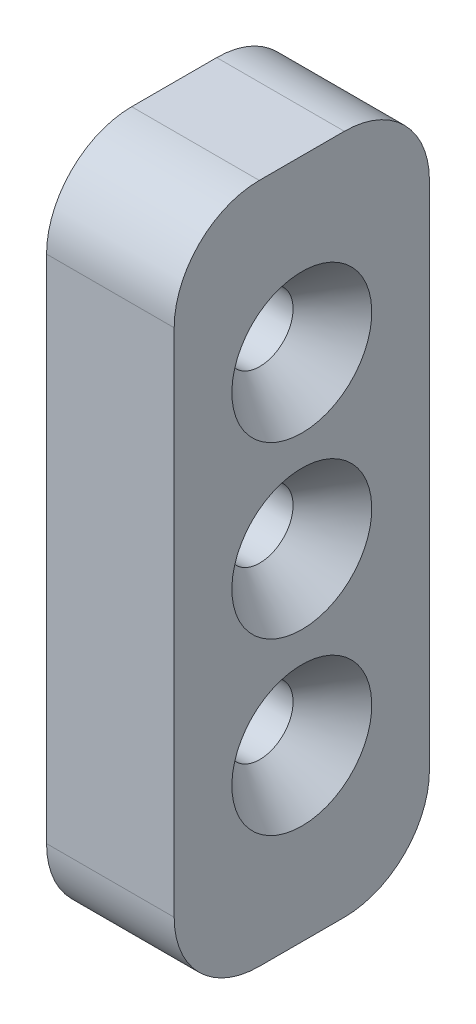
ISO-10303-21;
HEADER;
FILE_DESCRIPTION(('STEP AP214'),'2;1');
FILE_NAME('part.step','',(''),(''),'','','');
FILE_SCHEMA(('AUTOMOTIVE_DESIGN { 1 0 10303 214 1 1 1 1 }'));
ENDSEC;
DATA;
#1=APPLICATION_CONTEXT('core data for automotive mechanical design processes');
#2=APPLICATION_PROTOCOL_DEFINITION('international standard','automotive_design',2000,#1);
#3=PRODUCT_CONTEXT('',#1,'mechanical');
#4=PRODUCT('Part','Part','',(#3));
#5=PRODUCT_RELATED_PRODUCT_CATEGORY('part','',(#4));
#6=PRODUCT_DEFINITION_FORMATION('','',#4);
#7=PRODUCT_DEFINITION_CONTEXT('part definition',#1,'design');
#8=PRODUCT_DEFINITION('design','',#6,#7);
#9=PRODUCT_DEFINITION_SHAPE('','',#8);
#10=(LENGTH_UNIT() NAMED_UNIT(*) SI_UNIT(.MILLI.,.METRE.));
#11=(NAMED_UNIT(*) PLANE_ANGLE_UNIT() SI_UNIT($,.RADIAN.));
#12=(NAMED_UNIT(*) SI_UNIT($,.STERADIAN.) SOLID_ANGLE_UNIT());
#13=UNCERTAINTY_MEASURE_WITH_UNIT(LENGTH_MEASURE(1.E-05),#10,'distance_accuracy_value','');
#14=(GEOMETRIC_REPRESENTATION_CONTEXT(3) GLOBAL_UNCERTAINTY_ASSIGNED_CONTEXT((#13)) GLOBAL_UNIT_ASSIGNED_CONTEXT((#10,
#11,#12)) REPRESENTATION_CONTEXT('',''));
#15=CARTESIAN_POINT('',(0.,0.,0.));
#16=DIRECTION('',(0.,0.,1.));
#17=DIRECTION('',(1.,0.,0.));
#18=AXIS2_PLACEMENT_3D('',#15,#16,#17);
#19=CARTESIAN_POINT('',(333.375,4.03370492239524,361.95));
#20=DIRECTION('',(0.,0.,1.));
#21=DIRECTION('',(1.,0.,0.));
#22=AXIS2_PLACEMENT_3D('',#19,#20,#21);
#23=PLANE('',#22);
#24=DIRECTION('',(0.,1.,0.));
#25=VECTOR('',#24,1.);
#26=CARTESIAN_POINT('',(323.85,4.03370492239524,361.95));
#27=LINE('',#26,#25);
#28=CARTESIAN_POINT('',(323.85,-15.0162950776049,361.95));
#29=VERTEX_POINT('',#28);
#30=CARTESIAN_POINT('',(323.85,23.0837049223954,361.95));
#31=VERTEX_POINT('',#30);
#32=EDGE_CURVE('E93',#29,#31,#27,.T.);
#33=ORIENTED_EDGE('',*,*,#32,.F.);
#34=DIRECTION('',(-1.,0.,0.));
#35=VECTOR('',#34,1.);
#36=CARTESIAN_POINT('',(333.375,-15.0162950776049,361.95));
#37=LINE('',#36,#35);
#38=CARTESIAN_POINT('',(333.375,-15.0162950776049,361.95));
#39=VERTEX_POINT('',#38);
#40=EDGE_CURVE('E26',#29,#39,#37,.F.);
#41=ORIENTED_EDGE('',*,*,#40,.T.);
#42=DIRECTION('',(0.,1.,0.));
#43=VECTOR('',#42,1.);
#44=CARTESIAN_POINT('',(333.375,4.03370492239524,361.95));
#45=LINE('',#44,#43);
#46=CARTESIAN_POINT('',(333.375,23.0837049223954,361.95));
#47=VERTEX_POINT('',#46);
#48=EDGE_CURVE('E193',#39,#47,#45,.T.);
#49=ORIENTED_EDGE('',*,*,#48,.T.);
#50=DIRECTION('',(-1.,0.,0.));
#51=VECTOR('',#50,1.);
#52=CARTESIAN_POINT('',(333.375,23.0837049223954,361.95));
#53=LINE('',#52,#51);
#54=EDGE_CURVE('E139',#47,#31,#53,.T.);
#55=ORIENTED_EDGE('',*,*,#54,.T.);
#56=EDGE_LOOP('',(#33,#41,#49,#55));
#57=FACE_BOUND('',#56,.T.);
#58=ADVANCED_FACE('F17',(#57),#23,.T.);
#59=CARTESIAN_POINT('',(333.375,-21.3662950776048,352.425));
#60=DIRECTION('',(0.,1.,0.));
#61=DIRECTION('',(-1.,0.,0.));
#62=AXIS2_PLACEMENT_3D('',#59,#60,#61);
#63=PLANE('',#62);
#64=DIRECTION('',(0.,0.,-1.));
#65=VECTOR('',#64,1.);
#66=CARTESIAN_POINT('',(333.375,-21.3662950776048,352.425));
#67=LINE('',#66,#65);
#68=CARTESIAN_POINT('',(333.375,-21.3662950776048,355.6));
#69=VERTEX_POINT('',#68);
#70=CARTESIAN_POINT('',(333.375,-21.3662950776048,349.25));
#71=VERTEX_POINT('',#70);
#72=EDGE_CURVE('E109',#69,#71,#67,.T.);
#73=ORIENTED_EDGE('',*,*,#72,.F.);
#74=DIRECTION('',(-1.,0.,0.));
#75=VECTOR('',#74,1.);
#76=CARTESIAN_POINT('',(323.85,-21.3662950776048,355.6));
#77=LINE('',#76,#75);
#78=CARTESIAN_POINT('',(323.85,-21.3662950776048,355.6));
#79=VERTEX_POINT('',#78);
#80=EDGE_CURVE('E152',#69,#79,#77,.T.);
#81=ORIENTED_EDGE('',*,*,#80,.T.);
#82=DIRECTION('',(0.,0.,-1.));
#83=VECTOR('',#82,1.);
#84=CARTESIAN_POINT('',(323.85,-21.3662950776048,352.425));
#85=LINE('',#84,#83);
#86=CARTESIAN_POINT('',(323.85,-21.3662950776048,349.25));
#87=VERTEX_POINT('',#86);
#88=EDGE_CURVE('E162',#79,#87,#85,.T.);
#89=ORIENTED_EDGE('',*,*,#88,.T.);
#90=DIRECTION('',(-1.,0.,0.));
#91=VECTOR('',#90,1.);
#92=CARTESIAN_POINT('',(333.375,-21.3662950776048,349.25));
#93=LINE('',#92,#91);
#94=EDGE_CURVE('E132',#87,#71,#93,.F.);
#95=ORIENTED_EDGE('',*,*,#94,.T.);
#96=EDGE_LOOP('',(#73,#81,#89,#95));
#97=FACE_BOUND('',#96,.T.);
#98=ADVANCED_FACE('F220',(#97),#63,.F.);
#99=CARTESIAN_POINT('',(333.375,4.03370492239524,342.9));
#100=DIRECTION('',(0.,0.,1.));
#101=DIRECTION('',(1.,0.,0.));
#102=AXIS2_PLACEMENT_3D('',#99,#100,#101);
#103=PLANE('',#102);
#104=DIRECTION('',(0.,1.,0.));
#105=VECTOR('',#104,1.);
#106=CARTESIAN_POINT('',(333.375,4.03370492239524,342.9));
#107=LINE('',#106,#105);
#108=CARTESIAN_POINT('',(333.375,-15.0162950776049,342.9));
#109=VERTEX_POINT('',#108);
#110=CARTESIAN_POINT('',(333.375,23.0837049223954,342.9));
#111=VERTEX_POINT('',#110);
#112=EDGE_CURVE('E114',#109,#111,#107,.T.);
#113=ORIENTED_EDGE('',*,*,#112,.F.);
#114=DIRECTION('',(-1.,0.,0.));
#115=VECTOR('',#114,1.);
#116=CARTESIAN_POINT('',(333.375,-15.0162950776049,342.9));
#117=LINE('',#116,#115);
#118=CARTESIAN_POINT('',(323.85,-15.0162950776049,342.9));
#119=VERTEX_POINT('',#118);
#120=EDGE_CURVE('E124',#109,#119,#117,.T.);
#121=ORIENTED_EDGE('',*,*,#120,.T.);
#122=DIRECTION('',(0.,1.,0.));
#123=VECTOR('',#122,1.);
#124=CARTESIAN_POINT('',(323.85,4.03370492239524,342.9));
#125=LINE('',#124,#123);
#126=CARTESIAN_POINT('',(323.85,23.0837049223954,342.9));
#127=VERTEX_POINT('',#126);
#128=EDGE_CURVE('E92',#119,#127,#125,.T.);
#129=ORIENTED_EDGE('',*,*,#128,.T.);
#130=DIRECTION('',(-1.,0.,0.));
#131=VECTOR('',#130,1.);
#132=CARTESIAN_POINT('',(333.375,23.0837049223954,342.9));
#133=LINE('',#132,#131);
#134=EDGE_CURVE('E101',#127,#111,#133,.F.);
#135=ORIENTED_EDGE('',*,*,#134,.T.);
#136=EDGE_LOOP('',(#113,#121,#129,#135));
#137=FACE_BOUND('',#136,.T.);
#138=ADVANCED_FACE('F214',(#137),#103,.F.);
#139=CARTESIAN_POINT('',(333.375,29.4337049223953,352.425));
#140=DIRECTION('',(0.,1.,0.));
#141=DIRECTION('',(-1.,0.,0.));
#142=AXIS2_PLACEMENT_3D('',#139,#140,#141);
#143=PLANE('',#142);
#144=DIRECTION('',(0.,0.,-1.));
#145=VECTOR('',#144,1.);
#146=CARTESIAN_POINT('',(323.85,29.4337049223953,352.425));
#147=LINE('',#146,#145);
#148=CARTESIAN_POINT('',(323.85,29.4337049223953,355.6));
#149=VERTEX_POINT('',#148);
#150=CARTESIAN_POINT('',(323.85,29.4337049223953,349.25));
#151=VERTEX_POINT('',#150);
#152=EDGE_CURVE('E80',#149,#151,#147,.T.);
#153=ORIENTED_EDGE('',*,*,#152,.F.);
#154=DIRECTION('',(-1.,0.,0.));
#155=VECTOR('',#154,1.);
#156=CARTESIAN_POINT('',(333.375,29.4337049223953,355.6));
#157=LINE('',#156,#155);
#158=CARTESIAN_POINT('',(333.375,29.4337049223953,355.6));
#159=VERTEX_POINT('',#158);
#160=EDGE_CURVE('E145',#149,#159,#157,.F.);
#161=ORIENTED_EDGE('',*,*,#160,.T.);
#162=DIRECTION('',(0.,0.,-1.));
#163=VECTOR('',#162,1.);
#164=CARTESIAN_POINT('',(333.375,29.4337049223953,352.425));
#165=LINE('',#164,#163);
#166=CARTESIAN_POINT('',(333.375,29.4337049223953,349.25));
#167=VERTEX_POINT('',#166);
#168=EDGE_CURVE('E106',#159,#167,#165,.T.);
#169=ORIENTED_EDGE('',*,*,#168,.T.);
#170=DIRECTION('',(-1.,0.,0.));
#171=VECTOR('',#170,1.);
#172=CARTESIAN_POINT('',(323.85,29.4337049223953,349.25));
#173=LINE('',#172,#171);
#174=EDGE_CURVE('E99',#167,#151,#173,.T.);
#175=ORIENTED_EDGE('',*,*,#174,.T.);
#176=EDGE_LOOP('',(#153,#161,#169,#175));
#177=FACE_BOUND('',#176,.T.);
#178=ADVANCED_FACE('F104',(#177),#143,.T.);
#179=CARTESIAN_POINT('',(333.375,-147.208147538801,552.45));
#180=DIRECTION('',(1.,0.,0.));
#181=DIRECTION('',(0.,1.,0.));
#182=AXIS2_PLACEMENT_3D('',#179,#180,#181);
#183=PLANE('',#182);
#184=CARTESIAN_POINT('',(333.375,4.03370492239514,352.425));
#185=DIRECTION('',(-1.,0.,0.));
#186=DIRECTION('',(0.,-1.,0.));
#187=AXIS2_PLACEMENT_3D('',#184,#185,#186);
#188=CIRCLE('',#187,5.2197);
#189=CARTESIAN_POINT('',(333.375,-1.18599507760486,352.425));
#190=VERTEX_POINT('',#189);
#191=EDGE_CURVE('E167',#190,#190,#188,.T.);
#192=ORIENTED_EDGE('',*,*,#191,.T.);
#193=EDGE_LOOP('',(#192));
#194=FACE_BOUND('',#193,.T.);
#195=CARTESIAN_POINT('',(333.375,16.7337049223951,352.425));
#196=DIRECTION('',(-1.,0.,0.));
#197=DIRECTION('',(0.,-1.,0.));
#198=AXIS2_PLACEMENT_3D('',#195,#196,#197);
#199=CIRCLE('',#198,5.2197);
#200=CARTESIAN_POINT('',(333.375,11.5140049223951,352.425));
#201=VERTEX_POINT('',#200);
#202=EDGE_CURVE('E168',#201,#201,#199,.T.);
#203=ORIENTED_EDGE('',*,*,#202,.T.);
#204=EDGE_LOOP('',(#203));
#205=FACE_BOUND('',#204,.T.);
#206=CARTESIAN_POINT('',(333.375,-8.66629507760485,352.425));
#207=DIRECTION('',(-1.,0.,0.));
#208=DIRECTION('',(0.,-1.,0.));
#209=AXIS2_PLACEMENT_3D('',#206,#207,#208);
#210=CIRCLE('',#209,5.2197);
#211=CARTESIAN_POINT('',(333.375,-13.8859950776049,352.425));
#212=VERTEX_POINT('',#211);
#213=EDGE_CURVE('E174',#212,#212,#210,.T.);
#214=ORIENTED_EDGE('',*,*,#213,.T.);
#215=EDGE_LOOP('',(#214));
#216=FACE_BOUND('',#215,.T.);
#217=ORIENTED_EDGE('',*,*,#48,.F.);
#218=CARTESIAN_POINT('',(333.375,-15.0162950776049,355.6));
#219=DIRECTION('',(1.,0.,0.));
#220=DIRECTION('',(0.,1.,0.));
#221=AXIS2_PLACEMENT_3D('',#218,#219,#220);
#222=CIRCLE('',#221,6.35);
#223=EDGE_CURVE('E11',#39,#69,#222,.T.);
#224=ORIENTED_EDGE('',*,*,#223,.T.);
#225=ORIENTED_EDGE('',*,*,#72,.T.);
#226=CARTESIAN_POINT('',(333.375,-15.0162950776049,349.25));
#227=DIRECTION('',(1.,0.,0.));
#228=DIRECTION('',(0.,1.,0.));
#229=AXIS2_PLACEMENT_3D('',#226,#227,#228);
#230=CIRCLE('',#229,6.35);
#231=EDGE_CURVE('E136',#71,#109,#230,.T.);
#232=ORIENTED_EDGE('',*,*,#231,.T.);
#233=ORIENTED_EDGE('',*,*,#112,.T.);
#234=CARTESIAN_POINT('',(333.375,23.0837049223954,349.25));
#235=DIRECTION('',(1.,0.,0.));
#236=DIRECTION('',(0.,1.,0.));
#237=AXIS2_PLACEMENT_3D('',#234,#235,#236);
#238=CIRCLE('',#237,6.35);
#239=EDGE_CURVE('E121',#111,#167,#238,.T.);
#240=ORIENTED_EDGE('',*,*,#239,.T.);
#241=ORIENTED_EDGE('',*,*,#168,.F.);
#242=CARTESIAN_POINT('',(333.375,23.0837049223954,355.6));
#243=DIRECTION('',(1.,0.,0.));
#244=DIRECTION('',(0.,1.,0.));
#245=AXIS2_PLACEMENT_3D('',#242,#243,#244);
#246=CIRCLE('',#245,6.35);
#247=EDGE_CURVE('E148',#159,#47,#246,.T.);
#248=ORIENTED_EDGE('',*,*,#247,.T.);
#249=EDGE_LOOP('',(#217,#224,#225,#232,#233,#240,#241,#248));
#250=FACE_BOUND('',#249,.T.);
#251=ADVANCED_FACE('F210',(#194,#205,#216,#250),#183,.T.);
#252=CARTESIAN_POINT('',(323.85,-147.208147538801,552.45));
#253=DIRECTION('',(1.,0.,0.));
#254=DIRECTION('',(0.,1.,0.));
#255=AXIS2_PLACEMENT_3D('',#252,#253,#254);
#256=PLANE('',#255);
#257=CARTESIAN_POINT('',(323.85,4.03370492239515,352.425));
#258=DIRECTION('',(1.,0.,0.));
#259=DIRECTION('',(0.,1.,0.));
#260=AXIS2_PLACEMENT_3D('',#257,#258,#259);
#261=CIRCLE('',#260,2.4892);
#262=CARTESIAN_POINT('',(323.85,6.52290492239515,352.425));
#263=VERTEX_POINT('',#262);
#264=EDGE_CURVE('E117',#263,#263,#261,.F.);
#265=ORIENTED_EDGE('',*,*,#264,.F.);
#266=EDGE_LOOP('',(#265));
#267=FACE_BOUND('',#266,.T.);
#268=CARTESIAN_POINT('',(323.85,16.7337049223951,352.425));
#269=DIRECTION('',(1.,0.,0.));
#270=DIRECTION('',(0.,1.,0.));
#271=AXIS2_PLACEMENT_3D('',#268,#269,#270);
#272=CIRCLE('',#271,2.4892);
#273=CARTESIAN_POINT('',(323.85,19.2229049223951,352.425));
#274=VERTEX_POINT('',#273);
#275=EDGE_CURVE('E170',#274,#274,#272,.F.);
#276=ORIENTED_EDGE('',*,*,#275,.F.);
#277=EDGE_LOOP('',(#276));
#278=FACE_BOUND('',#277,.T.);
#279=CARTESIAN_POINT('',(323.85,-8.66629507760485,352.425));
#280=DIRECTION('',(1.,0.,0.));
#281=DIRECTION('',(0.,1.,0.));
#282=AXIS2_PLACEMENT_3D('',#279,#280,#281);
#283=CIRCLE('',#282,2.4892);
#284=CARTESIAN_POINT('',(323.85,-6.17709507760485,352.425));
#285=VERTEX_POINT('',#284);
#286=EDGE_CURVE('E173',#285,#285,#283,.F.);
#287=ORIENTED_EDGE('',*,*,#286,.F.);
#288=EDGE_LOOP('',(#287));
#289=FACE_BOUND('',#288,.T.);
#290=ORIENTED_EDGE('',*,*,#88,.F.);
#291=CARTESIAN_POINT('',(323.85,-15.0162950776049,355.6));
#292=DIRECTION('',(1.,0.,0.));
#293=DIRECTION('',(0.,1.,0.));
#294=AXIS2_PLACEMENT_3D('',#291,#292,#293);
#295=CIRCLE('',#294,6.35);
#296=EDGE_CURVE('E40',#79,#29,#295,.F.);
#297=ORIENTED_EDGE('',*,*,#296,.T.);
#298=ORIENTED_EDGE('',*,*,#32,.T.);
#299=CARTESIAN_POINT('',(323.85,23.0837049223954,355.6));
#300=DIRECTION('',(1.,0.,0.));
#301=DIRECTION('',(0.,1.,0.));
#302=AXIS2_PLACEMENT_3D('',#299,#300,#301);
#303=CIRCLE('',#302,6.35);
#304=EDGE_CURVE('E87',#31,#149,#303,.F.);
#305=ORIENTED_EDGE('',*,*,#304,.T.);
#306=ORIENTED_EDGE('',*,*,#152,.T.);
#307=CARTESIAN_POINT('',(323.85,23.0837049223954,349.25));
#308=DIRECTION('',(1.,0.,0.));
#309=DIRECTION('',(0.,1.,0.));
#310=AXIS2_PLACEMENT_3D('',#307,#308,#309);
#311=CIRCLE('',#310,6.35);
#312=EDGE_CURVE('E84',#151,#127,#311,.F.);
#313=ORIENTED_EDGE('',*,*,#312,.T.);
#314=ORIENTED_EDGE('',*,*,#128,.F.);
#315=CARTESIAN_POINT('',(323.85,-15.0162950776049,349.25));
#316=DIRECTION('',(1.,0.,0.));
#317=DIRECTION('',(0.,1.,0.));
#318=AXIS2_PLACEMENT_3D('',#315,#316,#317);
#319=CIRCLE('',#318,6.35);
#320=EDGE_CURVE('E128',#119,#87,#319,.F.);
#321=ORIENTED_EDGE('',*,*,#320,.T.);
#322=EDGE_LOOP('',(#290,#297,#298,#305,#306,#313,#314,#321));
#323=FACE_BOUND('',#322,.T.);
#324=ADVANCED_FACE('F82',(#267,#278,#289,#323),#256,.F.);
#325=CARTESIAN_POINT('',(333.375,-8.66629507760485,352.425));
#326=DIRECTION('',(-1.,0.,0.));
#327=DIRECTION('',(0.,-1.,0.));
#328=AXIS2_PLACEMENT_3D('',#325,#326,#327);
#329=CYLINDRICAL_SURFACE('',#328,2.4892);
#330=CARTESIAN_POINT('',(330.233919064083,-8.66629507760485,352.425));
#331=DIRECTION('',(-1.,0.,0.));
#332=DIRECTION('',(0.,-1.,0.));
#333=AXIS2_PLACEMENT_3D('',#330,#331,#332);
#334=CIRCLE('',#333,2.4892);
#335=CARTESIAN_POINT('',(330.233919064083,-11.1554950776049,352.425));
#336=VERTEX_POINT('',#335);
#337=EDGE_CURVE('E178',#336,#336,#334,.T.);
#338=ORIENTED_EDGE('',*,*,#337,.F.);
#339=EDGE_LOOP('',(#338));
#340=FACE_BOUND('',#339,.T.);
#341=ORIENTED_EDGE('',*,*,#286,.T.);
#342=EDGE_LOOP('',(#341));
#343=FACE_BOUND('',#342,.T.);
#344=ADVANCED_FACE('F260',(#340,#343),#329,.F.);
#345=CARTESIAN_POINT('',(333.375,-8.66629507760485,352.425));
#346=DIRECTION('',(1.,0.,0.));
#347=DIRECTION('',(0.,1.,0.));
#348=AXIS2_PLACEMENT_3D('',#345,#346,#347);
#349=CONICAL_SURFACE('',#348,5.2197,0.715584993317674);
#350=ORIENTED_EDGE('',*,*,#337,.T.);
#351=EDGE_LOOP('',(#350));
#352=FACE_BOUND('',#351,.T.);
#353=ORIENTED_EDGE('',*,*,#213,.F.);
#354=EDGE_LOOP('',(#353));
#355=FACE_BOUND('',#354,.T.);
#356=ADVANCED_FACE('F280',(#352,#355),#349,.F.);
#357=CARTESIAN_POINT('',(333.375,16.7337049223951,352.425));
#358=DIRECTION('',(-1.,0.,0.));
#359=DIRECTION('',(0.,-1.,0.));
#360=AXIS2_PLACEMENT_3D('',#357,#358,#359);
#361=CYLINDRICAL_SURFACE('',#360,2.4892);
#362=CARTESIAN_POINT('',(330.233919064083,16.7337049223951,352.425));
#363=DIRECTION('',(-1.,0.,0.));
#364=DIRECTION('',(0.,-1.,0.));
#365=AXIS2_PLACEMENT_3D('',#362,#363,#364);
#366=CIRCLE('',#365,2.4892);
#367=CARTESIAN_POINT('',(330.233919064083,14.2445049223951,352.425));
#368=VERTEX_POINT('',#367);
#369=EDGE_CURVE('E177',#368,#368,#366,.T.);
#370=ORIENTED_EDGE('',*,*,#369,.F.);
#371=EDGE_LOOP('',(#370));
#372=FACE_BOUND('',#371,.T.);
#373=ORIENTED_EDGE('',*,*,#275,.T.);
#374=EDGE_LOOP('',(#373));
#375=FACE_BOUND('',#374,.T.);
#376=ADVANCED_FACE('F287',(#372,#375),#361,.F.);
#377=CARTESIAN_POINT('',(333.375,16.7337049223951,352.425));
#378=DIRECTION('',(1.,0.,0.));
#379=DIRECTION('',(0.,1.,0.));
#380=AXIS2_PLACEMENT_3D('',#377,#378,#379);
#381=CONICAL_SURFACE('',#380,5.2197,0.715584993317674);
#382=ORIENTED_EDGE('',*,*,#369,.T.);
#383=EDGE_LOOP('',(#382));
#384=FACE_BOUND('',#383,.T.);
#385=ORIENTED_EDGE('',*,*,#202,.F.);
#386=EDGE_LOOP('',(#385));
#387=FACE_BOUND('',#386,.T.);
#388=ADVANCED_FACE('F251',(#384,#387),#381,.F.);
#389=CARTESIAN_POINT('',(333.375,4.03370492239514,352.425));
#390=DIRECTION('',(-1.,0.,0.));
#391=DIRECTION('',(0.,-1.,0.));
#392=AXIS2_PLACEMENT_3D('',#389,#390,#391);
#393=CYLINDRICAL_SURFACE('',#392,2.4892);
#394=CARTESIAN_POINT('',(330.233919064083,4.03370492239514,352.425));
#395=DIRECTION('',(-1.,0.,0.));
#396=DIRECTION('',(0.,-1.,0.));
#397=AXIS2_PLACEMENT_3D('',#394,#395,#396);
#398=CIRCLE('',#397,2.4892);
#399=CARTESIAN_POINT('',(330.233919064083,1.54450492239514,352.425));
#400=VERTEX_POINT('',#399);
#401=EDGE_CURVE('E164',#400,#400,#398,.T.);
#402=ORIENTED_EDGE('',*,*,#401,.F.);
#403=EDGE_LOOP('',(#402));
#404=FACE_BOUND('',#403,.T.);
#405=ORIENTED_EDGE('',*,*,#264,.T.);
#406=EDGE_LOOP('',(#405));
#407=FACE_BOUND('',#406,.T.);
#408=ADVANCED_FACE('F246',(#404,#407),#393,.F.);
#409=CARTESIAN_POINT('',(333.375,4.03370492239514,352.425));
#410=DIRECTION('',(1.,0.,0.));
#411=DIRECTION('',(0.,1.,0.));
#412=AXIS2_PLACEMENT_3D('',#409,#410,#411);
#413=CONICAL_SURFACE('',#412,5.2197,0.715584993317674);
#414=ORIENTED_EDGE('',*,*,#401,.T.);
#415=EDGE_LOOP('',(#414));
#416=FACE_BOUND('',#415,.T.);
#417=ORIENTED_EDGE('',*,*,#191,.F.);
#418=EDGE_LOOP('',(#417));
#419=FACE_BOUND('',#418,.T.);
#420=ADVANCED_FACE('F243',(#416,#419),#413,.F.);
#421=CARTESIAN_POINT('',(333.375,23.0837049223954,349.25));
#422=DIRECTION('',(1.,0.,0.));
#423=DIRECTION('',(0.,1.,0.));
#424=AXIS2_PLACEMENT_3D('',#421,#422,#423);
#425=CYLINDRICAL_SURFACE('',#424,6.35);
#426=ORIENTED_EDGE('',*,*,#239,.F.);
#427=ORIENTED_EDGE('',*,*,#134,.F.);
#428=ORIENTED_EDGE('',*,*,#312,.F.);
#429=ORIENTED_EDGE('',*,*,#174,.F.);
#430=EDGE_LOOP('',(#426,#427,#428,#429));
#431=FACE_BOUND('',#430,.T.);
#432=ADVANCED_FACE('F98',(#431),#425,.T.);
#433=CARTESIAN_POINT('',(333.375,-15.0162950776049,349.25));
#434=DIRECTION('',(-1.,0.,0.));
#435=DIRECTION('',(0.,-1.,0.));
#436=AXIS2_PLACEMENT_3D('',#433,#434,#435);
#437=CYLINDRICAL_SURFACE('',#436,6.35);
#438=ORIENTED_EDGE('',*,*,#231,.F.);
#439=ORIENTED_EDGE('',*,*,#94,.F.);
#440=ORIENTED_EDGE('',*,*,#320,.F.);
#441=ORIENTED_EDGE('',*,*,#120,.F.);
#442=EDGE_LOOP('',(#438,#439,#440,#441));
#443=FACE_BOUND('',#442,.T.);
#444=ADVANCED_FACE('F217',(#443),#437,.T.);
#445=CARTESIAN_POINT('',(333.375,23.0837049223954,355.6));
#446=DIRECTION('',(-1.,0.,0.));
#447=DIRECTION('',(0.,-1.,0.));
#448=AXIS2_PLACEMENT_3D('',#445,#446,#447);
#449=CYLINDRICAL_SURFACE('',#448,6.35);
#450=ORIENTED_EDGE('',*,*,#247,.F.);
#451=ORIENTED_EDGE('',*,*,#160,.F.);
#452=ORIENTED_EDGE('',*,*,#304,.F.);
#453=ORIENTED_EDGE('',*,*,#54,.F.);
#454=EDGE_LOOP('',(#450,#451,#452,#453));
#455=FACE_BOUND('',#454,.T.);
#456=ADVANCED_FACE('F227',(#455),#449,.T.);
#457=CARTESIAN_POINT('',(333.375,-15.0162950776049,355.6));
#458=DIRECTION('',(1.,0.,0.));
#459=DIRECTION('',(0.,1.,0.));
#460=AXIS2_PLACEMENT_3D('',#457,#458,#459);
#461=CYLINDRICAL_SURFACE('',#460,6.35);
#462=ORIENTED_EDGE('',*,*,#223,.F.);
#463=ORIENTED_EDGE('',*,*,#40,.F.);
#464=ORIENTED_EDGE('',*,*,#296,.F.);
#465=ORIENTED_EDGE('',*,*,#80,.F.);
#466=EDGE_LOOP('',(#462,#463,#464,#465));
#467=FACE_BOUND('',#466,.T.);
#468=ADVANCED_FACE('F19',(#467),#461,.T.);
#469=CLOSED_SHELL('',(#58,#98,#138,#178,#251,#324,#344,#356,#376,#388,#408,#420,#432,#444,#456,#468));
#470=MANIFOLD_SOLID_BREP('B1',#469);
#471=ADVANCED_BREP_SHAPE_REPRESENTATION('',(#18,#470),#14);
#472=SHAPE_DEFINITION_REPRESENTATION(#9,#471);
ENDSEC;
END-ISO-10303-21;
